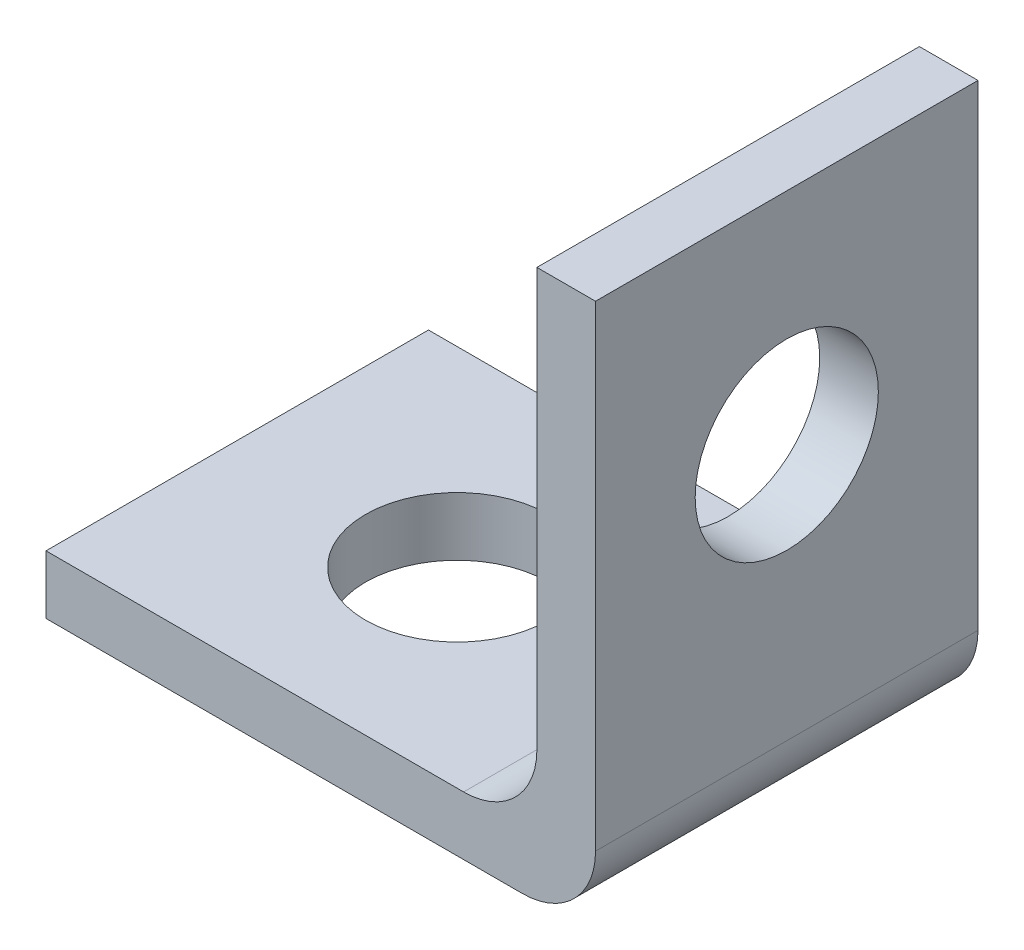
ISO-10303-21;
HEADER;
FILE_DESCRIPTION(('STEP AP214'),'2;1');
FILE_NAME('part.step','',(''),(''),'','','');
FILE_SCHEMA(('AUTOMOTIVE_DESIGN { 1 0 10303 214 1 1 1 1 }'));
ENDSEC;
DATA;
#1=APPLICATION_CONTEXT('core data for automotive mechanical design processes');
#2=APPLICATION_PROTOCOL_DEFINITION('international standard','automotive_design',2000,#1);
#3=PRODUCT_CONTEXT('',#1,'mechanical');
#4=PRODUCT('Part','Part','',(#3));
#5=PRODUCT_RELATED_PRODUCT_CATEGORY('part','',(#4));
#6=PRODUCT_DEFINITION_FORMATION('','',#4);
#7=PRODUCT_DEFINITION_CONTEXT('part definition',#1,'design');
#8=PRODUCT_DEFINITION('design','',#6,#7);
#9=PRODUCT_DEFINITION_SHAPE('','',#8);
#10=(LENGTH_UNIT() NAMED_UNIT(*) SI_UNIT(.MILLI.,.METRE.));
#11=(NAMED_UNIT(*) PLANE_ANGLE_UNIT() SI_UNIT($,.RADIAN.));
#12=(NAMED_UNIT(*) SI_UNIT($,.STERADIAN.) SOLID_ANGLE_UNIT());
#13=UNCERTAINTY_MEASURE_WITH_UNIT(LENGTH_MEASURE(1.E-05),#10,'distance_accuracy_value','');
#14=(GEOMETRIC_REPRESENTATION_CONTEXT(3) GLOBAL_UNCERTAINTY_ASSIGNED_CONTEXT((#13)) GLOBAL_UNIT_ASSIGNED_CONTEXT((#10,
#11,#12)) REPRESENTATION_CONTEXT('',''));
#15=CARTESIAN_POINT('',(0.,0.,0.));
#16=DIRECTION('',(0.,0.,1.));
#17=DIRECTION('',(1.,0.,0.));
#18=AXIS2_PLACEMENT_3D('',#15,#16,#17);
#19=CARTESIAN_POINT('',(-9.525,-1.016,-6.6294));
#20=DIRECTION('',(-1.,0.,0.));
#21=DIRECTION('',(0.,0.,1.));
#22=AXIS2_PLACEMENT_3D('',#19,#20,#21);
#23=PLANE('',#22);
#24=DIRECTION('',(0.,0.,1.));
#25=VECTOR('',#24,1.);
#26=CARTESIAN_POINT('',(-9.525,-1.016,-6.6294));
#27=LINE('',#26,#25);
#28=CARTESIAN_POINT('',(-9.525,-1.016,-6.6294));
#29=VERTEX_POINT('',#28);
#30=CARTESIAN_POINT('',(-9.525,-1.016,6.6294));
#31=VERTEX_POINT('',#30);
#32=EDGE_CURVE('E105',#29,#31,#27,.T.);
#33=ORIENTED_EDGE('',*,*,#32,.T.);
#34=DIRECTION('',(0.,-1.,0.));
#35=VECTOR('',#34,1.);
#36=CARTESIAN_POINT('',(-9.525,-1.016,6.6294));
#37=LINE('',#36,#35);
#38=CARTESIAN_POINT('',(-9.525,1.016,6.6294));
#39=VERTEX_POINT('',#38);
#40=EDGE_CURVE('E109',#39,#31,#37,.T.);
#41=ORIENTED_EDGE('',*,*,#40,.F.);
#42=DIRECTION('',(0.,0.,1.));
#43=VECTOR('',#42,1.);
#44=CARTESIAN_POINT('',(-9.525,1.016,-6.6294));
#45=LINE('',#44,#43);
#46=CARTESIAN_POINT('',(-9.525,1.016,-6.6294));
#47=VERTEX_POINT('',#46);
#48=EDGE_CURVE('E170',#47,#39,#45,.T.);
#49=ORIENTED_EDGE('',*,*,#48,.F.);
#50=DIRECTION('',(0.,-1.,0.));
#51=VECTOR('',#50,1.);
#52=CARTESIAN_POINT('',(-9.525,-1.016,-6.6294));
#53=LINE('',#52,#51);
#54=EDGE_CURVE('E111',#47,#29,#53,.T.);
#55=ORIENTED_EDGE('',*,*,#54,.T.);
#56=EDGE_LOOP('',(#33,#41,#49,#55));
#57=FACE_BOUND('',#56,.T.);
#58=ADVANCED_FACE('F39',(#57),#23,.T.);
#59=CARTESIAN_POINT('',(7.493,1.016,-6.6294));
#60=DIRECTION('',(0.,1.,0.));
#61=DIRECTION('',(-1.,0.,0.));
#62=AXIS2_PLACEMENT_3D('',#59,#60,#61);
#63=PLANE('',#62);
#64=CARTESIAN_POINT('',(-1.905,1.016,0.));
#65=DIRECTION('',(0.,1.,0.));
#66=DIRECTION('',(0.,0.,1.));
#67=AXIS2_PLACEMENT_3D('',#64,#65,#66);
#68=CIRCLE('',#67,3.17499999999999);
#69=CARTESIAN_POINT('',(-1.905,1.016,3.17499999999999));
#70=VERTEX_POINT('',#69);
#71=EDGE_CURVE('E137',#70,#70,#68,.T.);
#72=ORIENTED_EDGE('',*,*,#71,.F.);
#73=EDGE_LOOP('',(#72));
#74=FACE_BOUND('',#73,.T.);
#75=DIRECTION('',(-1.,0.,0.));
#76=VECTOR('',#75,1.);
#77=CARTESIAN_POINT('',(7.493,1.016,6.6294));
#78=LINE('',#77,#76);
#79=CARTESIAN_POINT('',(4.953,1.016,6.6294));
#80=VERTEX_POINT('',#79);
#81=EDGE_CURVE('E130',#80,#39,#78,.T.);
#82=ORIENTED_EDGE('',*,*,#81,.F.);
#83=DIRECTION('',(0.,0.,1.));
#84=VECTOR('',#83,1.);
#85=CARTESIAN_POINT('',(4.953,1.016,-6.6294));
#86=LINE('',#85,#84);
#87=CARTESIAN_POINT('',(4.953,1.016,-6.6294));
#88=VERTEX_POINT('',#87);
#89=EDGE_CURVE('E61',#80,#88,#86,.F.);
#90=ORIENTED_EDGE('',*,*,#89,.T.);
#91=DIRECTION('',(-1.,0.,0.));
#92=VECTOR('',#91,1.);
#93=CARTESIAN_POINT('',(7.493,1.016,-6.6294));
#94=LINE('',#93,#92);
#95=EDGE_CURVE('E117',#88,#47,#94,.T.);
#96=ORIENTED_EDGE('',*,*,#95,.T.);
#97=ORIENTED_EDGE('',*,*,#48,.T.);
#98=EDGE_LOOP('',(#82,#90,#96,#97));
#99=FACE_BOUND('',#98,.T.);
#100=ADVANCED_FACE('F199',(#74,#99),#63,.T.);
#101=CARTESIAN_POINT('',(7.493,1.016,-6.6294));
#102=DIRECTION('',(-1.,0.,0.));
#103=DIRECTION('',(0.,0.,1.));
#104=AXIS2_PLACEMENT_3D('',#101,#102,#103);
#105=PLANE('',#104);
#106=CARTESIAN_POINT('',(7.493,10.414,0.));
#107=DIRECTION('',(-1.,0.,0.));
#108=DIRECTION('',(0.,0.,1.));
#109=AXIS2_PLACEMENT_3D('',#106,#107,#108);
#110=CIRCLE('',#109,3.17499999999999);
#111=CARTESIAN_POINT('',(7.493,10.414,3.17499999999999));
#112=VERTEX_POINT('',#111);
#113=EDGE_CURVE('E260',#112,#112,#110,.T.);
#114=ORIENTED_EDGE('',*,*,#113,.F.);
#115=EDGE_LOOP('',(#114));
#116=FACE_BOUND('',#115,.T.);
#117=DIRECTION('',(0.,-1.,0.));
#118=VECTOR('',#117,1.);
#119=CARTESIAN_POINT('',(7.493,1.016,-6.6294));
#120=LINE('',#119,#118);
#121=CARTESIAN_POINT('',(7.493,18.034,-6.6294));
#122=VERTEX_POINT('',#121);
#123=CARTESIAN_POINT('',(7.493,3.556,-6.6294));
#124=VERTEX_POINT('',#123);
#125=EDGE_CURVE('E165',#122,#124,#120,.T.);
#126=ORIENTED_EDGE('',*,*,#125,.T.);
#127=DIRECTION('',(0.,0.,1.));
#128=VECTOR('',#127,1.);
#129=CARTESIAN_POINT('',(7.493,3.556,6.6294));
#130=LINE('',#129,#128);
#131=CARTESIAN_POINT('',(7.493,3.556,6.6294));
#132=VERTEX_POINT('',#131);
#133=EDGE_CURVE('E190',#124,#132,#130,.T.);
#134=ORIENTED_EDGE('',*,*,#133,.T.);
#135=DIRECTION('',(0.,-1.,0.));
#136=VECTOR('',#135,1.);
#137=CARTESIAN_POINT('',(7.493,1.016,6.6294));
#138=LINE('',#137,#136);
#139=CARTESIAN_POINT('',(7.493,18.034,6.6294));
#140=VERTEX_POINT('',#139);
#141=EDGE_CURVE('E147',#140,#132,#138,.T.);
#142=ORIENTED_EDGE('',*,*,#141,.F.);
#143=DIRECTION('',(0.,0.,1.));
#144=VECTOR('',#143,1.);
#145=CARTESIAN_POINT('',(7.493,18.034,-6.6294));
#146=LINE('',#145,#144);
#147=EDGE_CURVE('E173',#122,#140,#146,.T.);
#148=ORIENTED_EDGE('',*,*,#147,.F.);
#149=EDGE_LOOP('',(#126,#134,#142,#148));
#150=FACE_BOUND('',#149,.T.);
#151=ADVANCED_FACE('F201',(#116,#150),#105,.T.);
#152=CARTESIAN_POINT('',(7.493,18.034,-6.6294));
#153=DIRECTION('',(0.,1.,0.));
#154=DIRECTION('',(-1.,0.,0.));
#155=AXIS2_PLACEMENT_3D('',#152,#153,#154);
#156=PLANE('',#155);
#157=ORIENTED_EDGE('',*,*,#147,.T.);
#158=DIRECTION('',(-1.,0.,0.));
#159=VECTOR('',#158,1.);
#160=CARTESIAN_POINT('',(7.493,18.034,6.6294));
#161=LINE('',#160,#159);
#162=CARTESIAN_POINT('',(9.525,18.034,6.6294));
#163=VERTEX_POINT('',#162);
#164=EDGE_CURVE('E143',#163,#140,#161,.T.);
#165=ORIENTED_EDGE('',*,*,#164,.F.);
#166=DIRECTION('',(0.,0.,1.));
#167=VECTOR('',#166,1.);
#168=CARTESIAN_POINT('',(9.525,18.034,-6.6294));
#169=LINE('',#168,#167);
#170=CARTESIAN_POINT('',(9.525,18.034,-6.6294));
#171=VERTEX_POINT('',#170);
#172=EDGE_CURVE('E116',#171,#163,#169,.T.);
#173=ORIENTED_EDGE('',*,*,#172,.F.);
#174=DIRECTION('',(-1.,0.,0.));
#175=VECTOR('',#174,1.);
#176=CARTESIAN_POINT('',(7.493,18.034,-6.6294));
#177=LINE('',#176,#175);
#178=EDGE_CURVE('E161',#171,#122,#177,.T.);
#179=ORIENTED_EDGE('',*,*,#178,.T.);
#180=EDGE_LOOP('',(#157,#165,#173,#179));
#181=FACE_BOUND('',#180,.T.);
#182=ADVANCED_FACE('F207',(#181),#156,.T.);
#183=CARTESIAN_POINT('',(9.525,-1.016,-6.6294));
#184=DIRECTION('',(1.,0.,0.));
#185=DIRECTION('',(0.,0.,-1.));
#186=AXIS2_PLACEMENT_3D('',#183,#184,#185);
#187=PLANE('',#186);
#188=CARTESIAN_POINT('',(9.52500000000001,10.414,0.));
#189=DIRECTION('',(-1.,0.,0.));
#190=DIRECTION('',(0.,0.,1.));
#191=AXIS2_PLACEMENT_3D('',#188,#189,#190);
#192=CIRCLE('',#191,3.17499999999999);
#193=CARTESIAN_POINT('',(9.52500000000001,10.414,3.17499999999999));
#194=VERTEX_POINT('',#193);
#195=EDGE_CURVE('E257',#194,#194,#192,.T.);
#196=ORIENTED_EDGE('',*,*,#195,.T.);
#197=EDGE_LOOP('',(#196));
#198=FACE_BOUND('',#197,.T.);
#199=DIRECTION('',(0.,1.,0.));
#200=VECTOR('',#199,1.);
#201=CARTESIAN_POINT('',(9.525,-1.016,6.6294));
#202=LINE('',#201,#200);
#203=CARTESIAN_POINT('',(9.525,1.524,6.6294));
#204=VERTEX_POINT('',#203);
#205=EDGE_CURVE('E127',#204,#163,#202,.T.);
#206=ORIENTED_EDGE('',*,*,#205,.F.);
#207=DIRECTION('',(0.,0.,1.));
#208=VECTOR('',#207,1.);
#209=CARTESIAN_POINT('',(9.525,1.524,-6.6294));
#210=LINE('',#209,#208);
#211=CARTESIAN_POINT('',(9.525,1.524,-6.6294));
#212=VERTEX_POINT('',#211);
#213=EDGE_CURVE('E184',#204,#212,#210,.F.);
#214=ORIENTED_EDGE('',*,*,#213,.T.);
#215=DIRECTION('',(0.,1.,0.));
#216=VECTOR('',#215,1.);
#217=CARTESIAN_POINT('',(9.525,-1.016,-6.6294));
#218=LINE('',#217,#216);
#219=EDGE_CURVE('E158',#212,#171,#218,.T.);
#220=ORIENTED_EDGE('',*,*,#219,.T.);
#221=ORIENTED_EDGE('',*,*,#172,.T.);
#222=EDGE_LOOP('',(#206,#214,#220,#221));
#223=FACE_BOUND('',#222,.T.);
#224=ADVANCED_FACE('F211',(#198,#223),#187,.T.);
#225=CARTESIAN_POINT('',(9.525,-1.016,-6.6294));
#226=DIRECTION('',(0.,-1.,0.));
#227=DIRECTION('',(1.,0.,0.));
#228=AXIS2_PLACEMENT_3D('',#225,#226,#227);
#229=PLANE('',#228);
#230=CARTESIAN_POINT('',(-1.905,-1.01600000000001,0.));
#231=DIRECTION('',(0.,1.,0.));
#232=DIRECTION('',(0.,0.,1.));
#233=AXIS2_PLACEMENT_3D('',#230,#231,#232);
#234=CIRCLE('',#233,3.17499999999999);
#235=CARTESIAN_POINT('',(-1.905,-1.01600000000001,3.17499999999999));
#236=VERTEX_POINT('',#235);
#237=EDGE_CURVE('E133',#236,#236,#234,.T.);
#238=ORIENTED_EDGE('',*,*,#237,.T.);
#239=EDGE_LOOP('',(#238));
#240=FACE_BOUND('',#239,.T.);
#241=DIRECTION('',(1.,0.,0.));
#242=VECTOR('',#241,1.);
#243=CARTESIAN_POINT('',(9.525,-1.016,-6.6294));
#244=LINE('',#243,#242);
#245=CARTESIAN_POINT('',(6.985,-1.016,-6.6294));
#246=VERTEX_POINT('',#245);
#247=EDGE_CURVE('E155',#29,#246,#244,.T.);
#248=ORIENTED_EDGE('',*,*,#247,.T.);
#249=DIRECTION('',(0.,0.,1.));
#250=VECTOR('',#249,1.);
#251=CARTESIAN_POINT('',(6.985,-1.016,-6.6294));
#252=LINE('',#251,#250);
#253=CARTESIAN_POINT('',(6.985,-1.016,6.6294));
#254=VERTEX_POINT('',#253);
#255=EDGE_CURVE('E124',#246,#254,#252,.T.);
#256=ORIENTED_EDGE('',*,*,#255,.T.);
#257=DIRECTION('',(1.,0.,0.));
#258=VECTOR('',#257,1.);
#259=CARTESIAN_POINT('',(9.525,-1.016,6.6294));
#260=LINE('',#259,#258);
#261=EDGE_CURVE('E121',#31,#254,#260,.T.);
#262=ORIENTED_EDGE('',*,*,#261,.F.);
#263=ORIENTED_EDGE('',*,*,#32,.F.);
#264=EDGE_LOOP('',(#248,#256,#262,#263));
#265=FACE_BOUND('',#264,.T.);
#266=ADVANCED_FACE('F122',(#240,#265),#229,.T.);
#267=CARTESIAN_POINT('',(0.,0.,-6.6294));
#268=DIRECTION('',(0.,0.,1.));
#269=DIRECTION('',(1.,0.,0.));
#270=AXIS2_PLACEMENT_3D('',#267,#268,#269);
#271=PLANE('',#270);
#272=ORIENTED_EDGE('',*,*,#219,.F.);
#273=CARTESIAN_POINT('',(6.985,1.524,-6.6294));
#274=DIRECTION('',(0.,0.,1.));
#275=DIRECTION('',(1.,0.,0.));
#276=AXIS2_PLACEMENT_3D('',#273,#274,#275);
#277=CIRCLE('',#276,2.54);
#278=EDGE_CURVE('E187',#212,#246,#277,.F.);
#279=ORIENTED_EDGE('',*,*,#278,.T.);
#280=ORIENTED_EDGE('',*,*,#247,.F.);
#281=ORIENTED_EDGE('',*,*,#54,.F.);
#282=ORIENTED_EDGE('',*,*,#95,.F.);
#283=CARTESIAN_POINT('',(4.953,3.556,-6.6294));
#284=DIRECTION('',(0.,0.,1.));
#285=DIRECTION('',(1.,0.,0.));
#286=AXIS2_PLACEMENT_3D('',#283,#284,#285);
#287=CIRCLE('',#286,2.54);
#288=EDGE_CURVE('E11',#88,#124,#287,.T.);
#289=ORIENTED_EDGE('',*,*,#288,.T.);
#290=ORIENTED_EDGE('',*,*,#125,.F.);
#291=ORIENTED_EDGE('',*,*,#178,.F.);
#292=EDGE_LOOP('',(#272,#279,#280,#281,#282,#289,#290,#291));
#293=FACE_BOUND('',#292,.T.);
#294=ADVANCED_FACE('F204',(#293),#271,.F.);
#295=CARTESIAN_POINT('',(0.,0.,6.6294));
#296=DIRECTION('',(0.,0.,1.));
#297=DIRECTION('',(1.,0.,0.));
#298=AXIS2_PLACEMENT_3D('',#295,#296,#297);
#299=PLANE('',#298);
#300=ORIENTED_EDGE('',*,*,#261,.T.);
#301=CARTESIAN_POINT('',(6.985,1.524,6.6294));
#302=DIRECTION('',(0.,0.,1.));
#303=DIRECTION('',(1.,0.,0.));
#304=AXIS2_PLACEMENT_3D('',#301,#302,#303);
#305=CIRCLE('',#304,2.54);
#306=EDGE_CURVE('E181',#254,#204,#305,.T.);
#307=ORIENTED_EDGE('',*,*,#306,.T.);
#308=ORIENTED_EDGE('',*,*,#205,.T.);
#309=ORIENTED_EDGE('',*,*,#164,.T.);
#310=ORIENTED_EDGE('',*,*,#141,.T.);
#311=CARTESIAN_POINT('',(4.953,3.556,6.6294));
#312=DIRECTION('',(0.,0.,1.));
#313=DIRECTION('',(1.,0.,0.));
#314=AXIS2_PLACEMENT_3D('',#311,#312,#313);
#315=CIRCLE('',#314,2.54);
#316=EDGE_CURVE('E48',#132,#80,#315,.F.);
#317=ORIENTED_EDGE('',*,*,#316,.T.);
#318=ORIENTED_EDGE('',*,*,#81,.T.);
#319=ORIENTED_EDGE('',*,*,#40,.T.);
#320=EDGE_LOOP('',(#300,#307,#308,#309,#310,#317,#318,#319));
#321=FACE_BOUND('',#320,.T.);
#322=ADVANCED_FACE('F129',(#321),#299,.T.);
#323=CARTESIAN_POINT('',(-1.905,1.016,0.));
#324=DIRECTION('',(0.,1.,0.));
#325=DIRECTION('',(0.,0.,1.));
#326=AXIS2_PLACEMENT_3D('',#323,#324,#325);
#327=CYLINDRICAL_SURFACE('',#326,3.17499999999999);
#328=ORIENTED_EDGE('',*,*,#237,.F.);
#329=EDGE_LOOP('',(#328));
#330=FACE_BOUND('',#329,.T.);
#331=ORIENTED_EDGE('',*,*,#71,.T.);
#332=EDGE_LOOP('',(#331));
#333=FACE_BOUND('',#332,.T.);
#334=ADVANCED_FACE('F222',(#330,#333),#327,.F.);
#335=CARTESIAN_POINT('',(7.493,10.414,0.));
#336=DIRECTION('',(-1.,0.,0.));
#337=DIRECTION('',(0.,0.,1.));
#338=AXIS2_PLACEMENT_3D('',#335,#336,#337);
#339=CYLINDRICAL_SURFACE('',#338,3.17499999999999);
#340=ORIENTED_EDGE('',*,*,#195,.F.);
#341=EDGE_LOOP('',(#340));
#342=FACE_BOUND('',#341,.T.);
#343=ORIENTED_EDGE('',*,*,#113,.T.);
#344=EDGE_LOOP('',(#343));
#345=FACE_BOUND('',#344,.T.);
#346=ADVANCED_FACE('F217',(#342,#345),#339,.F.);
#347=CARTESIAN_POINT('',(6.985,1.524,-6.6294));
#348=DIRECTION('',(0.,0.,1.));
#349=DIRECTION('',(1.,0.,0.));
#350=AXIS2_PLACEMENT_3D('',#347,#348,#349);
#351=CYLINDRICAL_SURFACE('',#350,2.54);
#352=ORIENTED_EDGE('',*,*,#278,.F.);
#353=ORIENTED_EDGE('',*,*,#213,.F.);
#354=ORIENTED_EDGE('',*,*,#306,.F.);
#355=ORIENTED_EDGE('',*,*,#255,.F.);
#356=EDGE_LOOP('',(#352,#353,#354,#355));
#357=FACE_BOUND('',#356,.T.);
#358=ADVANCED_FACE('F215',(#357),#351,.T.);
#359=CARTESIAN_POINT('',(4.953,3.556,-6.6294));
#360=DIRECTION('',(0.,0.,-1.));
#361=DIRECTION('',(-1.,0.,0.));
#362=AXIS2_PLACEMENT_3D('',#359,#360,#361);
#363=CYLINDRICAL_SURFACE('',#362,2.54);
#364=ORIENTED_EDGE('',*,*,#288,.F.);
#365=ORIENTED_EDGE('',*,*,#89,.F.);
#366=ORIENTED_EDGE('',*,*,#316,.F.);
#367=ORIENTED_EDGE('',*,*,#133,.F.);
#368=EDGE_LOOP('',(#364,#365,#366,#367));
#369=FACE_BOUND('',#368,.T.);
#370=ADVANCED_FACE('F41',(#369),#363,.F.);
#371=CLOSED_SHELL('',(#58,#100,#151,#182,#224,#266,#294,#322,#334,#346,#358,#370));
#372=MANIFOLD_SOLID_BREP('B2',#371);
#373=ADVANCED_BREP_SHAPE_REPRESENTATION('',(#18,#372),#14);
#374=SHAPE_DEFINITION_REPRESENTATION(#9,#373);
ENDSEC;
END-ISO-10303-21;
